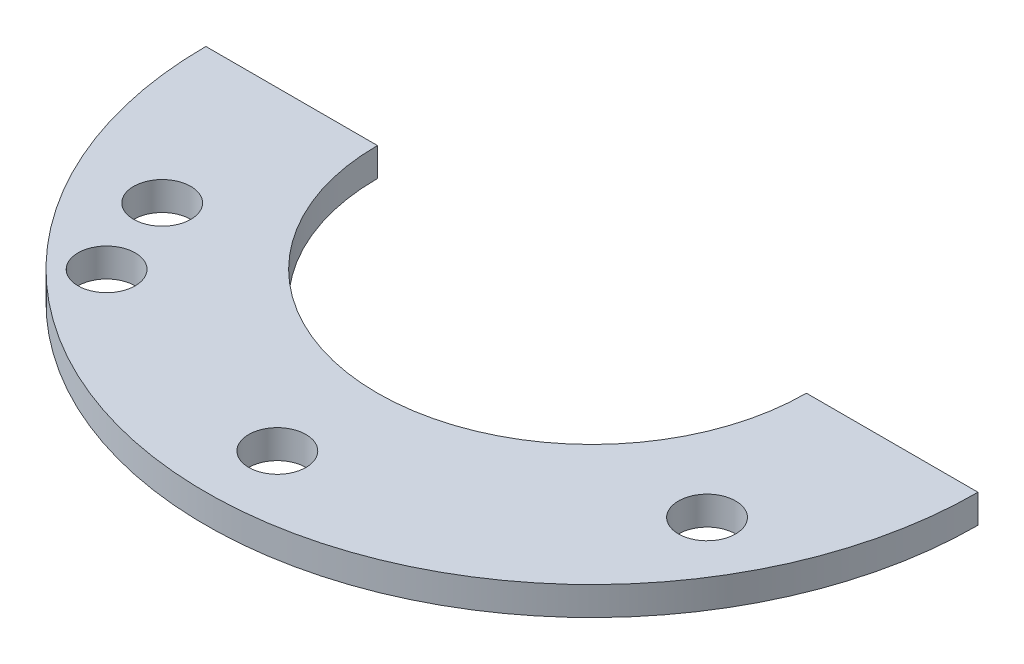
ISO-10303-21;
HEADER;
FILE_DESCRIPTION(('STEP AP214'),'2;1');
FILE_NAME('part.step','',(''),(''),'','','');
FILE_SCHEMA(('AUTOMOTIVE_DESIGN { 1 0 10303 214 1 1 1 1 }'));
ENDSEC;
DATA;
#1=APPLICATION_CONTEXT('core data for automotive mechanical design processes');
#2=APPLICATION_PROTOCOL_DEFINITION('international standard','automotive_design',2000,#1);
#3=PRODUCT_CONTEXT('',#1,'mechanical');
#4=PRODUCT('Part','Part','',(#3));
#5=PRODUCT_RELATED_PRODUCT_CATEGORY('part','',(#4));
#6=PRODUCT_DEFINITION_FORMATION('','',#4);
#7=PRODUCT_DEFINITION_CONTEXT('part definition',#1,'design');
#8=PRODUCT_DEFINITION('design','',#6,#7);
#9=PRODUCT_DEFINITION_SHAPE('','',#8);
#10=(LENGTH_UNIT() NAMED_UNIT(*) SI_UNIT(.MILLI.,.METRE.));
#11=(NAMED_UNIT(*) PLANE_ANGLE_UNIT() SI_UNIT($,.RADIAN.));
#12=(NAMED_UNIT(*) SI_UNIT($,.STERADIAN.) SOLID_ANGLE_UNIT());
#13=UNCERTAINTY_MEASURE_WITH_UNIT(LENGTH_MEASURE(1.E-05),#10,'distance_accuracy_value','');
#14=(GEOMETRIC_REPRESENTATION_CONTEXT(3) GLOBAL_UNCERTAINTY_ASSIGNED_CONTEXT((#13)) GLOBAL_UNIT_ASSIGNED_CONTEXT((#10,
#11,#12)) REPRESENTATION_CONTEXT('',''));
#15=CARTESIAN_POINT('',(0.,0.,0.));
#16=DIRECTION('',(0.,0.,1.));
#17=DIRECTION('',(1.,0.,0.));
#18=AXIS2_PLACEMENT_3D('',#15,#16,#17);
#19=CARTESIAN_POINT('',(0.,1.,0.));
#20=DIRECTION('',(0.,-1.,0.));
#21=DIRECTION('',(0.,0.,-1.));
#22=AXIS2_PLACEMENT_3D('',#19,#20,#21);
#23=CYLINDRICAL_SURFACE('',#22,13.5);
#24=CARTESIAN_POINT('',(0.,1.,0.));
#25=DIRECTION('',(0.,1.,0.));
#26=DIRECTION('',(0.,0.,1.));
#27=AXIS2_PLACEMENT_3D('',#24,#25,#26);
#28=CIRCLE('',#27,13.5);
#29=CARTESIAN_POINT('',(-13.5,1.,0.));
#30=VERTEX_POINT('',#29);
#31=CARTESIAN_POINT('',(13.5,1.,0.));
#32=VERTEX_POINT('',#31);
#33=EDGE_CURVE('E77',#30,#32,#28,.T.);
#34=ORIENTED_EDGE('',*,*,#33,.F.);
#35=DIRECTION('',(0.,-1.,0.));
#36=VECTOR('',#35,1.);
#37=CARTESIAN_POINT('',(-13.5,1.,0.));
#38=LINE('',#37,#36);
#39=CARTESIAN_POINT('',(-13.5,0.,0.));
#40=VERTEX_POINT('',#39);
#41=EDGE_CURVE('E125',#30,#40,#38,.T.);
#42=ORIENTED_EDGE('',*,*,#41,.T.);
#43=CARTESIAN_POINT('',(0.,0.,0.));
#44=DIRECTION('',(0.,1.,0.));
#45=DIRECTION('',(0.,0.,1.));
#46=AXIS2_PLACEMENT_3D('',#43,#44,#45);
#47=CIRCLE('',#46,13.5);
#48=CARTESIAN_POINT('',(13.5,0.,0.));
#49=VERTEX_POINT('',#48);
#50=EDGE_CURVE('E85',#40,#49,#47,.T.);
#51=ORIENTED_EDGE('',*,*,#50,.T.);
#52=DIRECTION('',(0.,-1.,0.));
#53=VECTOR('',#52,1.);
#54=CARTESIAN_POINT('',(13.5,1.,0.));
#55=LINE('',#54,#53);
#56=EDGE_CURVE('E89',#49,#32,#55,.F.);
#57=ORIENTED_EDGE('',*,*,#56,.T.);
#58=EDGE_LOOP('',(#34,#42,#51,#57));
#59=FACE_BOUND('',#58,.T.);
#60=ADVANCED_FACE('F33',(#59),#23,.T.);
#61=CARTESIAN_POINT('',(0.,1.,0.));
#62=DIRECTION('',(0.,1.,0.));
#63=DIRECTION('',(0.,0.,1.));
#64=AXIS2_PLACEMENT_3D('',#61,#62,#63);
#65=PLANE('',#64);
#66=DIRECTION('',(1.,0.,0.));
#67=VECTOR('',#66,1.);
#68=CARTESIAN_POINT('',(0.,1.,0.));
#69=LINE('',#68,#67);
#70=CARTESIAN_POINT('',(-7.5,1.,0.));
#71=VERTEX_POINT('',#70);
#72=EDGE_CURVE('E54',#30,#71,#69,.T.);
#73=ORIENTED_EDGE('',*,*,#72,.F.);
#74=ORIENTED_EDGE('',*,*,#33,.T.);
#75=CARTESIAN_POINT('',(7.5,1.,0.));
#76=VERTEX_POINT('',#75);
#77=EDGE_CURVE('E94',#76,#32,#69,.T.);
#78=ORIENTED_EDGE('',*,*,#77,.F.);
#79=CARTESIAN_POINT('',(0.,1.,0.));
#80=DIRECTION('',(0.,1.,0.));
#81=DIRECTION('',(0.,0.,1.));
#82=AXIS2_PLACEMENT_3D('',#79,#80,#81);
#83=CIRCLE('',#82,7.5);
#84=EDGE_CURVE('E88',#71,#76,#83,.T.);
#85=ORIENTED_EDGE('',*,*,#84,.F.);
#86=EDGE_LOOP('',(#73,#74,#78,#85));
#87=FACE_BOUND('',#86,.T.);
#88=CARTESIAN_POINT('',(-8.4852813742384,1.,8.48528137423842));
#89=DIRECTION('',(0.,1.,0.));
#90=DIRECTION('',(0.,0.,1.));
#91=AXIS2_PLACEMENT_3D('',#88,#89,#90);
#92=CIRCLE('',#91,1.);
#93=CARTESIAN_POINT('',(-8.4852813742384,1.,9.48528137423842));
#94=VERTEX_POINT('',#93);
#95=EDGE_CURVE('E118',#94,#94,#92,.T.);
#96=ORIENTED_EDGE('',*,*,#95,.F.);
#97=EDGE_LOOP('',(#96));
#98=FACE_BOUND('',#97,.T.);
#99=CARTESIAN_POINT('',(-9.52627944162847,1.,5.4999999999998));
#100=DIRECTION('',(0.,1.,0.));
#101=DIRECTION('',(0.,0.,1.));
#102=AXIS2_PLACEMENT_3D('',#99,#100,#101);
#103=CIRCLE('',#102,1.00000000000035);
#104=CARTESIAN_POINT('',(-9.52627944162847,1.,6.50000000000015));
#105=VERTEX_POINT('',#104);
#106=EDGE_CURVE('E115',#105,#105,#103,.T.);
#107=ORIENTED_EDGE('',*,*,#106,.F.);
#108=EDGE_LOOP('',(#107));
#109=FACE_BOUND('',#108,.T.);
#110=CARTESIAN_POINT('',(2.32162478298628E-13,1.,10.9999999999996));
#111=DIRECTION('',(0.,1.,0.));
#112=DIRECTION('',(0.,0.,1.));
#113=AXIS2_PLACEMENT_3D('',#110,#111,#112);
#114=CIRCLE('',#113,1.00000000000022);
#115=CARTESIAN_POINT('',(2.32162478298628E-13,1.,11.9999999999998));
#116=VERTEX_POINT('',#115);
#117=EDGE_CURVE('E112',#116,#116,#114,.T.);
#118=ORIENTED_EDGE('',*,*,#117,.F.);
#119=EDGE_LOOP('',(#118));
#120=FACE_BOUND('',#119,.T.);
#121=CARTESIAN_POINT('',(9.52627944162882,1.,5.4999999999996));
#122=DIRECTION('',(0.,1.,0.));
#123=DIRECTION('',(0.,0.,1.));
#124=AXIS2_PLACEMENT_3D('',#121,#122,#123);
#125=CIRCLE('',#124,1.00000000000043);
#126=CARTESIAN_POINT('',(9.52627944162882,1.,6.50000000000003));
#127=VERTEX_POINT('',#126);
#128=EDGE_CURVE('E107',#127,#127,#125,.T.);
#129=ORIENTED_EDGE('',*,*,#128,.F.);
#130=EDGE_LOOP('',(#129));
#131=FACE_BOUND('',#130,.T.);
#132=ADVANCED_FACE('F130',(#87,#98,#109,#120,#131),#65,.T.);
#133=CARTESIAN_POINT('',(0.,0.,0.));
#134=DIRECTION('',(0.,1.,0.));
#135=DIRECTION('',(0.,0.,1.));
#136=AXIS2_PLACEMENT_3D('',#133,#134,#135);
#137=PLANE('',#136);
#138=ORIENTED_EDGE('',*,*,#50,.F.);
#139=DIRECTION('',(1.,0.,0.));
#140=VECTOR('',#139,1.);
#141=CARTESIAN_POINT('',(0.,0.,0.));
#142=LINE('',#141,#140);
#143=CARTESIAN_POINT('',(-7.5,0.,0.));
#144=VERTEX_POINT('',#143);
#145=EDGE_CURVE('E71',#40,#144,#142,.T.);
#146=ORIENTED_EDGE('',*,*,#145,.T.);
#147=CARTESIAN_POINT('',(0.,0.,0.));
#148=DIRECTION('',(0.,1.,0.));
#149=DIRECTION('',(0.,0.,1.));
#150=AXIS2_PLACEMENT_3D('',#147,#148,#149);
#151=CIRCLE('',#150,7.5);
#152=CARTESIAN_POINT('',(7.5,0.,0.));
#153=VERTEX_POINT('',#152);
#154=EDGE_CURVE('E83',#144,#153,#151,.T.);
#155=ORIENTED_EDGE('',*,*,#154,.T.);
#156=EDGE_CURVE('E47',#153,#49,#142,.T.);
#157=ORIENTED_EDGE('',*,*,#156,.T.);
#158=EDGE_LOOP('',(#138,#146,#155,#157));
#159=FACE_BOUND('',#158,.T.);
#160=CARTESIAN_POINT('',(-8.4852813742384,0.,8.48528137423842));
#161=DIRECTION('',(0.,1.,0.));
#162=DIRECTION('',(0.,0.,1.));
#163=AXIS2_PLACEMENT_3D('',#160,#161,#162);
#164=CIRCLE('',#163,1.);
#165=CARTESIAN_POINT('',(-8.4852813742384,0.,9.48528137423842));
#166=VERTEX_POINT('',#165);
#167=EDGE_CURVE('E91',#166,#166,#164,.T.);
#168=ORIENTED_EDGE('',*,*,#167,.T.);
#169=EDGE_LOOP('',(#168));
#170=FACE_BOUND('',#169,.T.);
#171=CARTESIAN_POINT('',(-9.52627944162847,0.,5.4999999999998));
#172=DIRECTION('',(0.,1.,0.));
#173=DIRECTION('',(0.,0.,1.));
#174=AXIS2_PLACEMENT_3D('',#171,#172,#173);
#175=CIRCLE('',#174,1.00000000000035);
#176=CARTESIAN_POINT('',(-9.52627944162847,0.,6.50000000000015));
#177=VERTEX_POINT('',#176);
#178=EDGE_CURVE('E98',#177,#177,#175,.T.);
#179=ORIENTED_EDGE('',*,*,#178,.T.);
#180=EDGE_LOOP('',(#179));
#181=FACE_BOUND('',#180,.T.);
#182=CARTESIAN_POINT('',(2.32162478298628E-13,0.,10.9999999999996));
#183=DIRECTION('',(0.,1.,0.));
#184=DIRECTION('',(0.,0.,1.));
#185=AXIS2_PLACEMENT_3D('',#182,#183,#184);
#186=CIRCLE('',#185,1.00000000000022);
#187=CARTESIAN_POINT('',(2.32162478298628E-13,0.,11.9999999999998));
#188=VERTEX_POINT('',#187);
#189=EDGE_CURVE('E101',#188,#188,#186,.T.);
#190=ORIENTED_EDGE('',*,*,#189,.T.);
#191=EDGE_LOOP('',(#190));
#192=FACE_BOUND('',#191,.T.);
#193=CARTESIAN_POINT('',(9.52627944162882,0.,5.4999999999996));
#194=DIRECTION('',(0.,1.,0.));
#195=DIRECTION('',(0.,0.,1.));
#196=AXIS2_PLACEMENT_3D('',#193,#194,#195);
#197=CIRCLE('',#196,1.00000000000043);
#198=CARTESIAN_POINT('',(9.52627944162882,0.,6.50000000000003));
#199=VERTEX_POINT('',#198);
#200=EDGE_CURVE('E104',#199,#199,#197,.T.);
#201=ORIENTED_EDGE('',*,*,#200,.T.);
#202=EDGE_LOOP('',(#201));
#203=FACE_BOUND('',#202,.T.);
#204=ADVANCED_FACE('F81',(#159,#170,#181,#192,#203),#137,.F.);
#205=CARTESIAN_POINT('',(9.52627944162882,0.,5.4999999999996));
#206=DIRECTION('',(0.,1.,0.));
#207=DIRECTION('',(0.,0.,1.));
#208=AXIS2_PLACEMENT_3D('',#205,#206,#207);
#209=CYLINDRICAL_SURFACE('',#208,1.00000000000043);
#210=ORIENTED_EDGE('',*,*,#128,.T.);
#211=EDGE_LOOP('',(#210));
#212=FACE_BOUND('',#211,.T.);
#213=ORIENTED_EDGE('',*,*,#200,.F.);
#214=EDGE_LOOP('',(#213));
#215=FACE_BOUND('',#214,.T.);
#216=ADVANCED_FACE('F142',(#212,#215),#209,.F.);
#217=CARTESIAN_POINT('',(2.32162478298628E-13,0.,10.9999999999996));
#218=DIRECTION('',(0.,1.,0.));
#219=DIRECTION('',(0.,0.,1.));
#220=AXIS2_PLACEMENT_3D('',#217,#218,#219);
#221=CYLINDRICAL_SURFACE('',#220,1.00000000000022);
#222=ORIENTED_EDGE('',*,*,#117,.T.);
#223=EDGE_LOOP('',(#222));
#224=FACE_BOUND('',#223,.T.);
#225=ORIENTED_EDGE('',*,*,#189,.F.);
#226=EDGE_LOOP('',(#225));
#227=FACE_BOUND('',#226,.T.);
#228=ADVANCED_FACE('F145',(#224,#227),#221,.F.);
#229=CARTESIAN_POINT('',(-9.52627944162847,0.,5.4999999999998));
#230=DIRECTION('',(0.,1.,0.));
#231=DIRECTION('',(0.,0.,1.));
#232=AXIS2_PLACEMENT_3D('',#229,#230,#231);
#233=CYLINDRICAL_SURFACE('',#232,1.00000000000035);
#234=ORIENTED_EDGE('',*,*,#106,.T.);
#235=EDGE_LOOP('',(#234));
#236=FACE_BOUND('',#235,.T.);
#237=ORIENTED_EDGE('',*,*,#178,.F.);
#238=EDGE_LOOP('',(#237));
#239=FACE_BOUND('',#238,.T.);
#240=ADVANCED_FACE('F196',(#236,#239),#233,.F.);
#241=CARTESIAN_POINT('',(-8.4852813742384,0.,8.48528137423842));
#242=DIRECTION('',(0.,1.,0.));
#243=DIRECTION('',(0.,0.,1.));
#244=AXIS2_PLACEMENT_3D('',#241,#242,#243);
#245=CYLINDRICAL_SURFACE('',#244,1.);
#246=ORIENTED_EDGE('',*,*,#95,.T.);
#247=EDGE_LOOP('',(#246));
#248=FACE_BOUND('',#247,.T.);
#249=ORIENTED_EDGE('',*,*,#167,.F.);
#250=EDGE_LOOP('',(#249));
#251=FACE_BOUND('',#250,.T.);
#252=ADVANCED_FACE('F174',(#248,#251),#245,.F.);
#253=CARTESIAN_POINT('',(0.,0.,0.));
#254=DIRECTION('',(0.,1.,0.));
#255=DIRECTION('',(0.,0.,1.));
#256=AXIS2_PLACEMENT_3D('',#253,#254,#255);
#257=CYLINDRICAL_SURFACE('',#256,7.5);
#258=ORIENTED_EDGE('',*,*,#84,.T.);
#259=DIRECTION('',(0.,1.,0.));
#260=VECTOR('',#259,1.);
#261=CARTESIAN_POINT('',(7.5,0.,0.));
#262=LINE('',#261,#260);
#263=EDGE_CURVE('E11',#76,#153,#262,.F.);
#264=ORIENTED_EDGE('',*,*,#263,.T.);
#265=ORIENTED_EDGE('',*,*,#154,.F.);
#266=DIRECTION('',(0.,1.,0.));
#267=VECTOR('',#266,1.);
#268=CARTESIAN_POINT('',(-7.5,0.,0.));
#269=LINE('',#268,#267);
#270=EDGE_CURVE('E40',#144,#71,#269,.T.);
#271=ORIENTED_EDGE('',*,*,#270,.T.);
#272=EDGE_LOOP('',(#258,#264,#265,#271));
#273=FACE_BOUND('',#272,.T.);
#274=ADVANCED_FACE('F87',(#273),#257,.F.);
#275=CARTESIAN_POINT('',(0.,0.,0.));
#276=DIRECTION('',(0.,0.,1.));
#277=DIRECTION('',(1.,0.,0.));
#278=AXIS2_PLACEMENT_3D('',#275,#276,#277);
#279=PLANE('',#278);
#280=ORIENTED_EDGE('',*,*,#72,.T.);
#281=ORIENTED_EDGE('',*,*,#270,.F.);
#282=ORIENTED_EDGE('',*,*,#145,.F.);
#283=ORIENTED_EDGE('',*,*,#41,.F.);
#284=EDGE_LOOP('',(#280,#281,#282,#283));
#285=FACE_BOUND('',#284,.T.);
#286=ADVANCED_FACE('F70',(#285),#279,.F.);
#287=ORIENTED_EDGE('',*,*,#156,.F.);
#288=ORIENTED_EDGE('',*,*,#263,.F.);
#289=ORIENTED_EDGE('',*,*,#77,.T.);
#290=ORIENTED_EDGE('',*,*,#56,.F.);
#291=EDGE_LOOP('',(#287,#288,#289,#290));
#292=FACE_BOUND('',#291,.T.);
#293=ADVANCED_FACE('F128',(#292),#279,.F.);
#294=CLOSED_SHELL('',(#60,#132,#204,#216,#228,#240,#252,#274,#286,#293));
#295=MANIFOLD_SOLID_BREP('B2',#294);
#296=ADVANCED_BREP_SHAPE_REPRESENTATION('',(#18,#295),#14);
#297=SHAPE_DEFINITION_REPRESENTATION(#9,#296);
ENDSEC;
END-ISO-10303-21;
